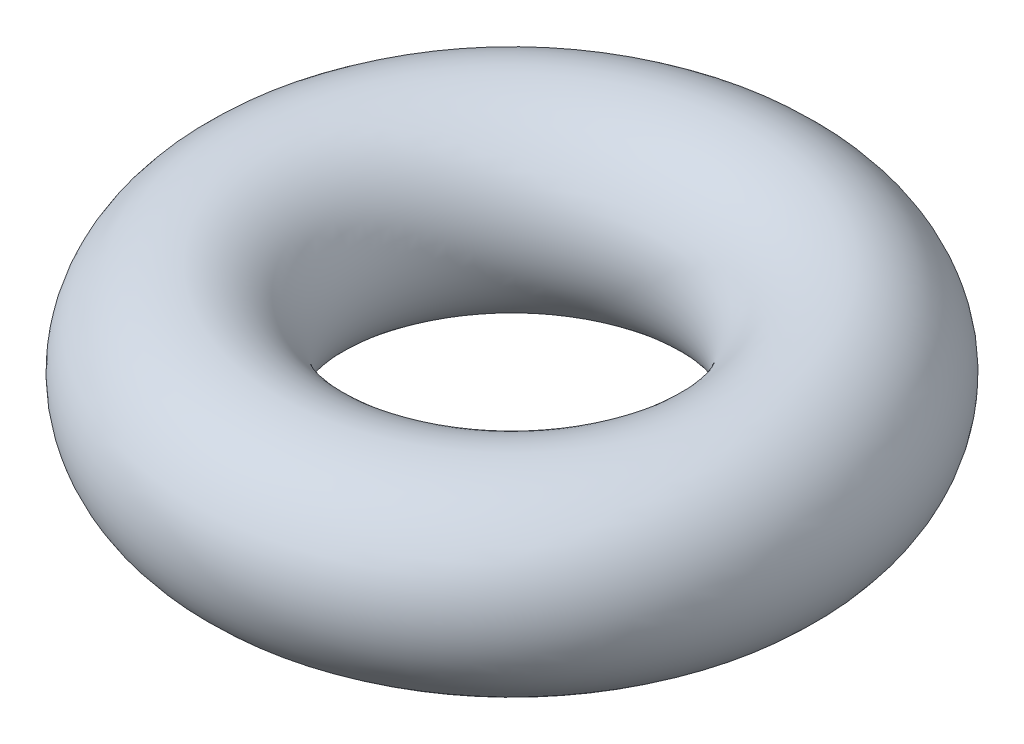
ISO-10303-21;
HEADER;
FILE_DESCRIPTION(('STEP AP214'),'2;1');
FILE_NAME('part.step','',(''),(''),'','','');
FILE_SCHEMA(('AUTOMOTIVE_DESIGN { 1 0 10303 214 1 1 1 1 }'));
ENDSEC;
DATA;
#1=APPLICATION_CONTEXT('core data for automotive mechanical design processes');
#2=APPLICATION_PROTOCOL_DEFINITION('international standard','automotive_design',2000,#1);
#3=PRODUCT_CONTEXT('',#1,'mechanical');
#4=PRODUCT('Part','Part','',(#3));
#5=PRODUCT_RELATED_PRODUCT_CATEGORY('part','',(#4));
#6=PRODUCT_DEFINITION_FORMATION('','',#4);
#7=PRODUCT_DEFINITION_CONTEXT('part definition',#1,'design');
#8=PRODUCT_DEFINITION('design','',#6,#7);
#9=PRODUCT_DEFINITION_SHAPE('','',#8);
#10=(LENGTH_UNIT() NAMED_UNIT(*) SI_UNIT(.MILLI.,.METRE.));
#11=(NAMED_UNIT(*) PLANE_ANGLE_UNIT() SI_UNIT($,.RADIAN.));
#12=(NAMED_UNIT(*) SI_UNIT($,.STERADIAN.) SOLID_ANGLE_UNIT());
#13=UNCERTAINTY_MEASURE_WITH_UNIT(LENGTH_MEASURE(1.E-05),#10,'distance_accuracy_value','');
#14=(GEOMETRIC_REPRESENTATION_CONTEXT(3) GLOBAL_UNCERTAINTY_ASSIGNED_CONTEXT((#13)) GLOBAL_UNIT_ASSIGNED_CONTEXT((#10,
#11,#12)) REPRESENTATION_CONTEXT('',''));
#15=CARTESIAN_POINT('',(0.,0.,0.));
#16=DIRECTION('',(0.,0.,1.));
#17=DIRECTION('',(1.,0.,0.));
#18=AXIS2_PLACEMENT_3D('',#15,#16,#17);
#19=CARTESIAN_POINT('',(0.,0.,0.));
#20=DIRECTION('',(0.,-1.,0.));
#21=DIRECTION('',(0.,0.,-1.));
#22=AXIS2_PLACEMENT_3D('',#19,#20,#21);
#23=TOROIDAL_SURFACE('',#22,2.5,1.);
#24=CARTESIAN_POINT('',(0.,0.,-3.5));
#25=VERTEX_POINT('',#24);
#26=VERTEX_LOOP('',#25);
#27=FACE_BOUND('',#26,.T.);
#28=ADVANCED_FACE('F30',(#27),#23,.T.);
#29=CLOSED_SHELL('',(#28));
#30=MANIFOLD_SOLID_BREP('B2',#29);
#31=ADVANCED_BREP_SHAPE_REPRESENTATION('',(#18,#30),#14);
#32=SHAPE_DEFINITION_REPRESENTATION(#9,#31);
ENDSEC;
END-ISO-10303-21;
